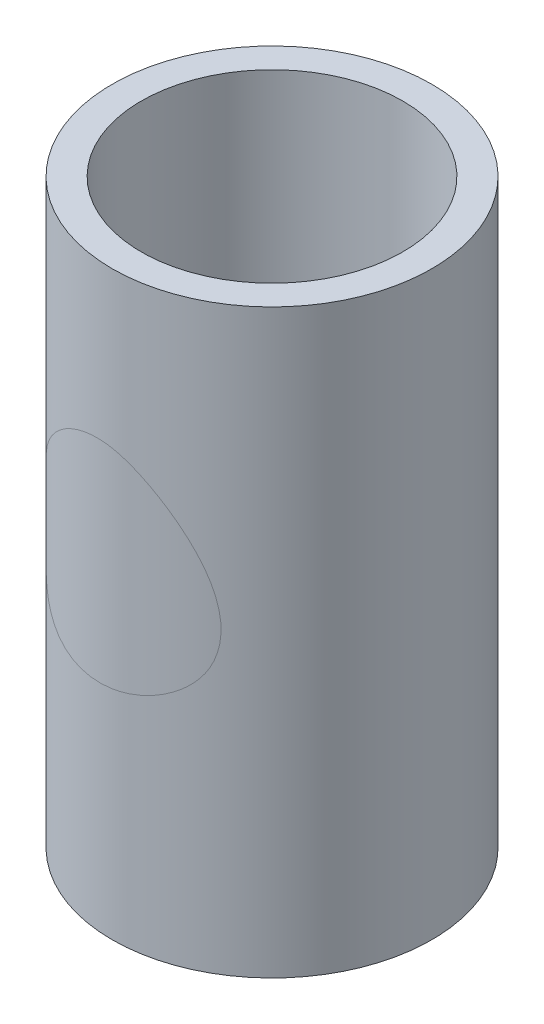
ISO-10303-21;
HEADER;
FILE_DESCRIPTION(('STEP AP214'),'2;1');
FILE_NAME('part.step','',(''),(''),'','','');
FILE_SCHEMA(('AUTOMOTIVE_DESIGN { 1 0 10303 214 1 1 1 1 }'));
ENDSEC;
DATA;
#1=APPLICATION_CONTEXT('core data for automotive mechanical design processes');
#2=APPLICATION_PROTOCOL_DEFINITION('international standard','automotive_design',2000,#1);
#3=PRODUCT_CONTEXT('',#1,'mechanical');
#4=PRODUCT('Part','Part','',(#3));
#5=PRODUCT_RELATED_PRODUCT_CATEGORY('part','',(#4));
#6=PRODUCT_DEFINITION_FORMATION('','',#4);
#7=PRODUCT_DEFINITION_CONTEXT('part definition',#1,'design');
#8=PRODUCT_DEFINITION('design','',#6,#7);
#9=PRODUCT_DEFINITION_SHAPE('','',#8);
#10=(LENGTH_UNIT() NAMED_UNIT(*) SI_UNIT(.MILLI.,.METRE.));
#11=(NAMED_UNIT(*) PLANE_ANGLE_UNIT() SI_UNIT($,.RADIAN.));
#12=(NAMED_UNIT(*) SI_UNIT($,.STERADIAN.) SOLID_ANGLE_UNIT());
#13=UNCERTAINTY_MEASURE_WITH_UNIT(LENGTH_MEASURE(1.E-05),#10,'distance_accuracy_value','');
#14=(GEOMETRIC_REPRESENTATION_CONTEXT(3) GLOBAL_UNCERTAINTY_ASSIGNED_CONTEXT((#13)) GLOBAL_UNIT_ASSIGNED_CONTEXT((#10,
#11,#12)) REPRESENTATION_CONTEXT('',''));
#15=CARTESIAN_POINT('',(0.,0.,0.));
#16=DIRECTION('',(0.,0.,1.));
#17=DIRECTION('',(1.,0.,0.));
#18=AXIS2_PLACEMENT_3D('',#15,#16,#17);
#19=CARTESIAN_POINT('',(0.,-110.603092707212,0.));
#20=DIRECTION('',(0.,-1.,0.));
#21=DIRECTION('',(0.,0.,-1.));
#22=AXIS2_PLACEMENT_3D('',#19,#20,#21);
#23=CYLINDRICAL_SURFACE('',#22,54.9999999999999);
#24=CARTESIAN_POINT('',(0.,-25.194290891013,54.9999999999999));
#25=CARTESIAN_POINT('',(-0.769635632629279,-25.3133468431184,54.9999985989301));
#26=CARTESIAN_POINT('',(-1.54168918856929,-25.4170021725145,54.9838323909333));
#27=CARTESIAN_POINT('',(-3.0881394742996,-25.5941521212312,54.9186911774526));
#28=CARTESIAN_POINT('',(-3.86253697855002,-25.6676353412383,54.8697037901726));
#29=CARTESIAN_POINT('',(-5.41086367903397,-25.7849432346175,54.7387084793448));
#30=CARTESIAN_POINT('',(-6.18479282171174,-25.8287649900198,54.6566973083218));
#31=CARTESIAN_POINT('',(-7.73044705579733,-25.8872555284095,54.4595989085027));
#32=CARTESIAN_POINT('',(-8.50216850853937,-25.9018901388309,54.3444730889367));
#33=CARTESIAN_POINT('',(-10.0399530573601,-25.9023261258038,54.0814911809593));
#34=CARTESIAN_POINT('',(-10.806016697777,-25.8881303133765,53.9336382847527));
#35=CARTESIAN_POINT('',(-12.3300781664512,-25.831276292568,53.6057550295856));
#36=CARTESIAN_POINT('',(-13.0880762826321,-25.7886191036896,53.4257258233684));
#37=CARTESIAN_POINT('',(-14.9674505826923,-25.6469616813471,52.9370293072579));
#38=CARTESIAN_POINT('',(-16.0825478212693,-25.5305083929235,52.6088520378179));
#39=CARTESIAN_POINT('',(-18.2821935004827,-25.2351696257859,51.8854758175703));
#40=CARTESIAN_POINT('',(-19.3667407008103,-25.0562816162055,51.4902741501819));
#41=CARTESIAN_POINT('',(-21.4999033570254,-24.6358503587398,50.6366929222699));
#42=CARTESIAN_POINT('',(-22.5484746693679,-24.3942330485546,50.1782389838428));
#43=CARTESIAN_POINT('',(-24.0880887387714,-23.9844422041611,49.4478236627187));
#44=CARTESIAN_POINT('',(-24.5957985639241,-23.8399354849473,49.1972042201271));
#45=CARTESIAN_POINT('',(-25.599439395016,-23.5349079956144,48.6825081122192));
#46=CARTESIAN_POINT('',(-26.0953710909357,-23.3743881664464,48.4184322380658));
#47=CARTESIAN_POINT('',(-27.2550417215235,-22.9749368012779,47.7781156032671));
#48=CARTESIAN_POINT('',(-27.913323136058,-22.7288979774651,47.3963810239539));
#49=CARTESIAN_POINT('',(-29.2044408088648,-22.2052864738067,46.6119220238927));
#50=CARTESIAN_POINT('',(-29.8372744627336,-21.9277105774227,46.2091954643957));
#51=CARTESIAN_POINT('',(-31.0756284644232,-21.3394137919747,45.3856638732849));
#52=CARTESIAN_POINT('',(-31.6811370708494,-21.028678844054,44.964851219006));
#53=CARTESIAN_POINT('',(-32.8609728761854,-20.372765564127,44.1099266252312));
#54=CARTESIAN_POINT('',(-33.4353699401493,-20.0276698047966,43.6758482266955));
#55=CARTESIAN_POINT('',(-34.2725665084919,-19.4816331316875,43.0176404443085));
#56=CARTESIAN_POINT('',(-34.5475399077,-19.2949083227681,42.7970780014399));
#57=CARTESIAN_POINT('',(-35.0890219562662,-18.911486057088,42.3542534724482));
#58=CARTESIAN_POINT('',(-35.3555311795514,-18.7147892788512,42.1319915028379));
#59=CARTESIAN_POINT('',(-35.8794718489683,-18.3110223212072,41.68670774502));
#60=CARTESIAN_POINT('',(-36.1369099138545,-18.1039599837386,41.4636866467071));
#61=CARTESIAN_POINT('',(-36.6423939119236,-17.6787119093581,41.0176623640266));
#62=CARTESIAN_POINT('',(-36.8904403993409,-17.4605268306319,40.7946591793793));
#63=CARTESIAN_POINT('',(-37.4756739546687,-16.9209293406651,40.2590198900827));
#64=CARTESIAN_POINT('',(-37.8080040951898,-16.5936775368405,39.9468829590219));
#65=CARTESIAN_POINT('',(-38.2901242636656,-16.0834563913702,39.4831133776639));
#66=CARTESIAN_POINT('',(-38.4480991044091,-15.9101620778471,39.3292655614228));
#67=CARTESIAN_POINT('',(-38.7583038022103,-15.5567487437245,39.0235987781884));
#68=CARTESIAN_POINT('',(-38.9105336269523,-15.3766296847474,38.8717798226105));
#69=CARTESIAN_POINT('',(-39.2086164614003,-15.009560677205,38.5710919578538));
#70=CARTESIAN_POINT('',(-39.3544804967693,-14.822623659968,38.4222182137393));
#71=CARTESIAN_POINT('',(-39.6396877758904,-14.4412119409531,38.1279050971707));
#72=CARTESIAN_POINT('',(-39.7790310507255,-14.2467372751135,37.9824657083474));
#73=CARTESIAN_POINT('',(-40.0508073531968,-13.8500442000312,37.6957801777937));
#74=CARTESIAN_POINT('',(-40.1832410169453,-13.6478265066091,37.5545336505783));
#75=CARTESIAN_POINT('',(-40.4409248106409,-13.2356475553262,37.2769028223812));
#76=CARTESIAN_POINT('',(-40.5661751063555,-13.0256864763402,37.1405184092261));
#77=CARTESIAN_POINT('',(-40.8939469172478,-12.4488403756668,36.7801438241746));
#78=CARTESIAN_POINT('',(-41.0894509764553,-12.0746190938184,36.5613784692761));
#79=CARTESIAN_POINT('',(-41.4573425621271,-11.3043684924336,36.1436892804378));
#80=CARTESIAN_POINT('',(-41.6297313052268,-10.9083403222145,35.9447644023696));
#81=CARTESIAN_POINT('',(-41.9498865643675,-10.0958376997679,35.570600916947));
#82=CARTESIAN_POINT('',(-42.0976633400668,-9.67937186131926,35.3953524457101));
#83=CARTESIAN_POINT('',(-42.3674350956991,-8.82787445058567,35.0719956399806));
#84=CARTESIAN_POINT('',(-42.4894308909443,-8.39284346593848,34.92388644724));
#85=CARTESIAN_POINT('',(-42.6708805438155,-7.65364481234964,34.7017167525567));
#86=CARTESIAN_POINT('',(-42.7376810396606,-7.35372665816883,34.6193583167352));
#87=CARTESIAN_POINT('',(-42.8592754080087,-6.74794089742885,34.4687090096695));
#88=CARTESIAN_POINT('',(-42.9140686185641,-6.4420729638768,34.4004189140087));
#89=CARTESIAN_POINT('',(-43.0116629190218,-5.8256071614727,34.2783162208957));
#90=CARTESIAN_POINT('',(-43.0544649991607,-5.51500968542458,34.2245024279941));
#91=CARTESIAN_POINT('',(-43.1282668344601,-4.8901733897323,34.1314536672551));
#92=CARTESIAN_POINT('',(-43.1592635795366,-4.57593366241732,34.0922224176857));
#93=CARTESIAN_POINT('',(-43.2097440388519,-3.94505668883369,34.0282188831055));
#94=CARTESIAN_POINT('',(-43.2292269843134,-3.62841928390126,34.0034475635865));
#95=CARTESIAN_POINT('',(-43.2570951274328,-2.99386511564483,33.9679882575203));
#96=CARTESIAN_POINT('',(-43.2654796999855,-2.67594828126966,33.9573010642482));
#97=CARTESIAN_POINT('',(-43.2714322096202,-2.06274814890926,33.9497153470685));
#98=CARTESIAN_POINT('',(-43.2697350281753,-1.76748223238851,33.951880015866));
#99=CARTESIAN_POINT('',(-43.2576676329082,-1.17740121349929,33.9672526988574));
#100=CARTESIAN_POINT('',(-43.2472962346749,-0.882586178203599,33.9804622211584));
#101=CARTESIAN_POINT('',(-43.2038704553997,0.000326940784108314,34.0356868490902));
#102=CARTESIAN_POINT('',(-43.1585046568898,0.586918547827248,34.0932978101956));
#103=CARTESIAN_POINT('',(-43.0386770819247,1.75334103508765,34.2444359798472));
#104=CARTESIAN_POINT('',(-42.9641593411883,2.33315668896356,34.338032265037));
#105=CARTESIAN_POINT('',(-42.7896021430997,3.48310140252437,34.5553084240023));
#106=CARTESIAN_POINT('',(-42.6895628090316,4.05323050898666,34.6789881524574));
#107=CARTESIAN_POINT('',(-42.4390698331557,5.32508555548958,34.9853341911194));
#108=CARTESIAN_POINT('',(-42.2822647103443,6.02385308481464,35.1750127493939));
#109=CARTESIAN_POINT('',(-41.9383230473946,7.40533194822248,35.5843866104059));
#110=CARTESIAN_POINT('',(-41.7511630916416,8.08803041737778,35.8041050651061));
#111=CARTESIAN_POINT('',(-41.3502642759264,9.43790194111241,36.2663657914871));
#112=CARTESIAN_POINT('',(-41.1365158268307,10.1050692908161,36.5089162898226));
#113=CARTESIAN_POINT('',(-40.6842273166771,11.4279464970682,37.0122778952439));
#114=CARTESIAN_POINT('',(-40.445571697369,12.0835848174212,37.273172103725));
#115=CARTESIAN_POINT('',(-39.9466009197799,13.3809205576133,37.8074417848611));
#116=CARTESIAN_POINT('',(-39.6862963104742,14.0226245772495,38.0808111497373));
#117=CARTESIAN_POINT('',(-39.1455286067727,15.2934865957804,38.6364840333939));
#118=CARTESIAN_POINT('',(-38.86506625121,15.9226450534235,38.9187872245146));
#119=CARTESIAN_POINT('',(-38.3496204909567,17.030755034864,39.425965544629));
#120=CARTESIAN_POINT('',(-38.1183883926008,17.512003658357,39.6496549086707));
#121=CARTESIAN_POINT('',(-37.6448442662995,18.4678545566681,40.0995305233786));
#122=CARTESIAN_POINT('',(-37.4025319431922,18.9424566539915,40.3257168404384));
#123=CARTESIAN_POINT('',(-36.9070504073754,19.8854964728257,40.779683540284));
#124=CARTESIAN_POINT('',(-36.6538764605303,20.3539313876446,41.0074645811952));
#125=CARTESIAN_POINT('',(-36.1370051861737,21.2846640873254,41.4636670291889));
#126=CARTESIAN_POINT('',(-35.8733075198563,21.7469616739596,41.6920884566677));
#127=CARTESIAN_POINT('',(-35.335395774469,22.665863149713,42.1489550435229));
#128=CARTESIAN_POINT('',(-35.0611749576457,23.1224631342559,42.377400121454));
#129=CARTESIAN_POINT('',(-34.5024927844746,24.0297586397919,42.8334919655609));
#130=CARTESIAN_POINT('',(-34.2180314058509,24.4804541479384,43.061138729999));
#131=CARTESIAN_POINT('',(-33.6387247673434,25.376293168214,43.5151896844233));
#132=CARTESIAN_POINT('',(-33.3438723279378,25.8214325420117,43.7415928852061));
#133=CARTESIAN_POINT('',(-32.7439896633503,26.7057906956176,44.1924420354581));
#134=CARTESIAN_POINT('',(-32.4389594489086,27.1450094816729,44.4168879869924));
#135=CARTESIAN_POINT('',(-31.5114501684446,28.44917960554,45.0844436389375));
#136=CARTESIAN_POINT('',(-30.8736582615573,29.3051256542327,45.5240498634805));
#137=CARTESIAN_POINT('',(-29.5558824433042,30.989933758079,46.3904245688644));
#138=CARTESIAN_POINT('',(-28.8759169606291,31.8188074047556,46.8171985376761));
#139=CARTESIAN_POINT('',(-27.4718899595584,33.4454290725943,47.6546208353841));
#140=CARTESIAN_POINT('',(-26.7478724548424,34.2432068959585,48.0652846068406));
#141=CARTESIAN_POINT('',(-25.6265723554847,35.4127111401458,48.6668097614373));
#142=CARTESIAN_POINT('',(-25.2470707714862,35.7978839699981,48.8648371645455));
#143=CARTESIAN_POINT('',(-24.4757857695502,36.5584352039616,49.2556884017118));
#144=CARTESIAN_POINT('',(-24.0840028232211,36.9338139831557,49.4485124350532));
#145=CARTESIAN_POINT('',(-23.1420147353813,37.8091772299366,49.8979991046556));
#146=CARTESIAN_POINT('',(-22.5862875068839,38.3045079905392,50.1522095266265));
#147=CARTESIAN_POINT('',(-21.4498420122877,39.2719696988885,50.6486798393438));
#148=CARTESIAN_POINT('',(-20.8691246715872,39.7441015043216,50.8909401718971));
#149=CARTESIAN_POINT('',(-19.6808501243504,40.6617226678641,51.362174912013));
#150=CARTESIAN_POINT('',(-19.0732702814085,41.107188781683,51.5911377231902));
#151=CARTESIAN_POINT('',(-17.8304580787995,41.9661942822453,52.0337378285605));
#152=CARTESIAN_POINT('',(-17.1952256134839,42.3797335469934,52.2473750641932));
#153=CARTESIAN_POINT('',(-15.8887703000662,43.1732606252921,52.6594849207539));
#154=CARTESIAN_POINT('',(-15.2172246160249,43.5528219140228,52.8577614239088));
#155=CARTESIAN_POINT('',(-13.8440348809459,44.2654596954617,53.2339121250028));
#156=CARTESIAN_POINT('',(-13.1423859101492,44.5985285518207,53.4117829704743));
#157=CARTESIAN_POINT('',(-11.7109207972726,45.2081097315352,53.7437728710584));
#158=CARTESIAN_POINT('',(-10.9811601891806,45.4847273831224,53.897936025643));
#159=CARTESIAN_POINT('',(-9.49472397822451,45.9710620967721,54.1795277161191));
#160=CARTESIAN_POINT('',(-8.7380658969735,46.1808218549953,54.3069732962642));
#161=CARTESIAN_POINT('',(-7.46387794637227,46.4636578817643,54.4936063178729));
#162=CARTESIAN_POINT('',(-6.95247130555767,46.5589592304044,54.561271679455));
#163=CARTESIAN_POINT('',(-5.92236853464055,46.7118769274929,54.6826686520292));
#164=CARTESIAN_POINT('',(-5.40367329673325,46.7694978480434,54.7364019530448));
#165=CARTESIAN_POINT('',(-4.36306789148308,46.843936941327,54.8291527050792));
#166=CARTESIAN_POINT('',(-3.84116627898419,46.8608368737767,54.8681995103591));
#167=CARTESIAN_POINT('',(-2.79676465940698,46.8517224163309,54.9313354288999));
#168=CARTESIAN_POINT('',(-2.27426468853063,46.8257104984335,54.9554254036604));
#169=CARTESIAN_POINT('',(-1.4054486416883,46.7454315356884,54.9831451614988));
#170=CARTESIAN_POINT('',(-1.0580976962638,46.703376572707,54.9909089119142));
#171=CARTESIAN_POINT('',(-0.539252139542642,46.6254381248459,54.9976284843881));
#172=CARTESIAN_POINT('',(-0.366653373741229,46.5969797699011,54.9990472493979));
#173=CARTESIAN_POINT('',(-0.0223394076427391,46.5351129507948,55.0002649512526));
#174=CARTESIAN_POINT('',(0.149375784122106,46.5017044389246,55.0000638724847));
#175=CARTESIAN_POINT('',(0.662946786684946,46.3942189704753,54.9970696139749));
#176=CARTESIAN_POINT('',(1.00329440314275,46.3128720659831,54.9918862512293));
#177=CARTESIAN_POINT('',(1.67954133120593,46.1319277308365,54.9753924862206));
#178=CARTESIAN_POINT('',(2.01543186039246,46.0322987524968,54.9640714256627));
#179=CARTESIAN_POINT('',(2.6815131577887,45.8161605951438,54.9356042221575));
#180=CARTESIAN_POINT('',(3.01170334646845,45.6996497109964,54.9184574905607));
#181=CARTESIAN_POINT('',(3.66584643000666,45.4510378449892,54.878675117683));
#182=CARTESIAN_POINT('',(3.98979842513981,45.3189346335721,54.8560386909378));
#183=CARTESIAN_POINT('',(4.76528656234023,44.9820879171666,54.7950743332915));
#184=CARTESIAN_POINT('',(5.21347592024361,44.7700821136861,54.7541441721922));
#185=CARTESIAN_POINT('',(6.09594255446588,44.3204981372511,54.6629342654439));
#186=CARTESIAN_POINT('',(6.53021533264166,44.0829118021627,54.6126515318679));
#187=CARTESIAN_POINT('',(7.38454745900423,43.5851561703819,54.5037055208399));
#188=CARTESIAN_POINT('',(7.80460539128554,43.324984633182,54.4450414115611));
#189=CARTESIAN_POINT('',(8.63136109349406,42.78411885077,54.3201138843861));
#190=CARTESIAN_POINT('',(9.03802881788932,42.5033824796317,54.2538347001963));
#191=CARTESIAN_POINT('',(9.83722584766964,41.9241841111286,54.1146328598499));
#192=CARTESIAN_POINT('',(10.2297574665812,41.6257250356499,54.0417112977484));
#193=CARTESIAN_POINT('',(11.0010822522829,41.0129660487566,53.889986756296));
#194=CARTESIAN_POINT('',(11.3798742190562,40.6986647593895,53.8111832650485));
#195=CARTESIAN_POINT('',(12.3788688652572,39.8358441476654,53.5926820781402));
#196=CARTESIAN_POINT('',(12.986814635363,39.2742818404481,53.4482288504389));
#197=CARTESIAN_POINT('',(14.1668191941351,38.1171775737913,53.1476442869675));
#198=CARTESIAN_POINT('',(14.7388575493716,37.5216166286528,52.9915064107613));
#199=CARTESIAN_POINT('',(15.8486239690971,36.3014521908356,52.6702462452911));
#200=CARTESIAN_POINT('',(16.3863435569174,35.6768415883018,52.5051217548674));
#201=CARTESIAN_POINT('',(17.4296957926028,34.4013447976111,52.1680624112938));
#202=CARTESIAN_POINT('',(17.9352715759002,33.7504152034106,51.9961163173305));
#203=CARTESIAN_POINT('',(18.914361595887,32.4263435063975,51.6480081430544));
#204=CARTESIAN_POINT('',(19.3878860009683,31.7532085500583,51.4718474240765));
#205=CARTESIAN_POINT('',(20.3038746256791,30.3867285029559,51.1174509376898));
#206=CARTESIAN_POINT('',(20.7463399088256,29.6933841053498,50.9392152415755));
#207=CARTESIAN_POINT('',(21.6336653090849,28.2339374881073,50.5690919455115));
#208=CARTESIAN_POINT('',(22.0760804685246,27.4663468547471,50.3772111646804));
#209=CARTESIAN_POINT('',(22.9256454965967,25.9111200140025,49.9963145288728));
#210=CARTESIAN_POINT('',(23.3327922648911,25.1234820521763,49.807298926968));
#211=CARTESIAN_POINT('',(24.1114690448692,23.5292466091889,49.435041174254));
#212=CARTESIAN_POINT('',(24.4829919919822,22.7226454067505,49.2518001734247));
#213=CARTESIAN_POINT('',(25.188790829937,21.0929182551225,48.8945904468529));
#214=CARTESIAN_POINT('',(25.5231271449187,20.2698217560021,48.7206069260317));
#215=CARTESIAN_POINT('',(26.1536243381807,18.6067757766362,48.3850744533859));
#216=CARTESIAN_POINT('',(26.4497918430306,17.7668292511021,48.2235233451107));
#217=CARTESIAN_POINT('',(27.0016529270463,16.071041402196,47.9167026375366));
#218=CARTESIAN_POINT('',(27.2573583655407,15.2152048186378,47.771428271224));
#219=CARTESIAN_POINT('',(27.7275170110281,13.4803241218874,47.5000967871307));
#220=CARTESIAN_POINT('',(27.9415588176917,12.6011373201116,47.3742336412475));
#221=CARTESIAN_POINT('',(28.3212354204254,10.8290031103219,47.1482397950509));
#222=CARTESIAN_POINT('',(28.4868712105377,9.93605598527992,47.0481085663245));
#223=CARTESIAN_POINT('',(28.7644877794294,8.13937064023945,46.8788944397331));
#224=CARTESIAN_POINT('',(28.8765013686601,7.23563936675941,46.8097925571834));
#225=CARTESIAN_POINT('',(29.0407711838624,5.42063665910498,46.708064240028));
#226=CARTESIAN_POINT('',(29.0930396840441,4.5093668124397,46.675430313367));
#227=CARTESIAN_POINT('',(29.1267876621617,2.87240456911359,46.6543711011255));
#228=CARTESIAN_POINT('',(29.1206090917261,2.1470672839492,46.6582377549517));
#229=CARTESIAN_POINT('',(29.0621169421589,0.698917113209374,46.694696806459));
#230=CARTESIAN_POINT('',(29.0098088364805,-0.0238960616467437,46.7272857961202));
#231=CARTESIAN_POINT('',(28.8552480747175,-1.46125120434941,46.8228889157461));
#232=CARTESIAN_POINT('',(28.7530620720109,-2.17580291137324,46.885862440628));
#233=CARTESIAN_POINT('',(28.495082272075,-3.59194185867211,47.0430999148776));
#234=CARTESIAN_POINT('',(28.3392841019793,-4.29352803649609,47.1373664166289));
#235=CARTESIAN_POINT('',(28.0312165979056,-5.4511282774721,47.3209408783482));
#236=CARTESIAN_POINT('',(27.8943565661119,-5.91263254739829,47.4018458481041));
#237=CARTESIAN_POINT('',(27.5943214920716,-6.82442840573641,47.5771339703477));
#238=CARTESIAN_POINT('',(27.431146706705,-7.27472010355399,47.6715169912639));
#239=CARTESIAN_POINT('',(27.0781166723877,-8.16174691189086,47.8729240081288));
#240=CARTESIAN_POINT('',(26.888267626078,-8.59848514529267,47.9799450643993));
#241=CARTESIAN_POINT('',(26.5834686070219,-9.24173293230334,48.1490671377243));
#242=CARTESIAN_POINT('',(26.4785281522301,-9.45417802852776,48.2068746427919));
#243=CARTESIAN_POINT('',(26.2619802451615,-9.8748890786998,48.325186217763));
#244=CARTESIAN_POINT('',(26.1503728280338,-10.0831550546726,48.3856902734495));
#245=CARTESIAN_POINT('',(25.9205171668667,-10.4952634892544,48.5092136954321));
#246=CARTESIAN_POINT('',(25.8022680846894,-10.6991053850511,48.5722333788936));
#247=CARTESIAN_POINT('',(25.5592178790917,-11.1021053641018,48.7005673395371));
#248=CARTESIAN_POINT('',(25.4344167504627,-11.3012634436324,48.7658816185431));
#249=CARTESIAN_POINT('',(25.1785442488099,-11.6948396914445,48.8984833201898));
#250=CARTESIAN_POINT('',(25.0474728174892,-11.889257815632,48.9657707611732));
#251=CARTESIAN_POINT('',(24.779333874754,-12.2733065195397,49.1020085287406));
#252=CARTESIAN_POINT('',(24.642266309833,-12.462937056514,49.170958870161));
#253=CARTESIAN_POINT('',(24.2084137434843,-13.0434235599045,49.3868440652752));
#254=CARTESIAN_POINT('',(23.9018147501748,-13.4261388662032,49.5361197909573));
#255=CARTESIAN_POINT('',(23.265656969773,-14.1705310674886,49.8380700752228));
#256=CARTESIAN_POINT('',(22.9360953651872,-14.5322053707359,49.9907450493218));
#257=CARTESIAN_POINT('',(22.2561429392372,-15.2349353233023,50.2971485223119));
#258=CARTESIAN_POINT('',(21.9057513202993,-15.5759901821006,50.450877061344));
#259=CARTESIAN_POINT('',(21.1850503943711,-16.2389742287854,50.7577332884697));
#260=CARTESIAN_POINT('',(20.8146863330798,-16.5608451549797,50.91085794626));
#261=CARTESIAN_POINT('',(20.056765343306,-17.1849953388242,51.2141852011735));
#262=CARTESIAN_POINT('',(19.6692103753942,-17.4872768209634,51.3643881287147));
#263=CARTESIAN_POINT('',(18.8784021517568,-18.0729789257967,51.6602767261643));
#264=CARTESIAN_POINT('',(18.4751474077695,-18.3563977534701,51.8059619654548));
#265=CARTESIAN_POINT('',(17.6573757323872,-18.9030002629081,52.0903362428539));
#266=CARTESIAN_POINT('',(17.2429619814029,-19.166316066326,52.2290684409297));
#267=CARTESIAN_POINT('',(16.4013073030036,-19.6756067263758,52.4994527189071));
#268=CARTESIAN_POINT('',(15.974064817393,-19.9215794642477,52.6311039332778));
#269=CARTESIAN_POINT('',(15.1078610268787,-20.396766619091,52.886259025641));
#270=CARTESIAN_POINT('',(14.6688972602169,-20.6259774772556,53.0097611729196));
#271=CARTESIAN_POINT('',(13.7804030266315,-21.0681062164449,53.2476494543975));
#272=CARTESIAN_POINT('',(13.330871496773,-21.2810224492665,53.3620346664662));
#273=CARTESIAN_POINT('',(11.969362822324,-21.8953990961488,53.689887886416));
#274=CARTESIAN_POINT('',(11.0430001282284,-22.2732875138669,53.888490763203));
#275=CARTESIAN_POINT('',(9.16007218817373,-22.9690319229291,54.240302205563));
#276=CARTESIAN_POINT('',(8.20351651810221,-23.2869067290433,54.3935250067662));
#277=CARTESIAN_POINT('',(6.64590190327571,-23.7521616456699,54.6002374272896));
#278=CARTESIAN_POINT('',(6.05218887395702,-23.9175870791709,54.6692924363778));
#279=CARTESIAN_POINT('',(4.85750188251285,-24.2277152355963,54.7883644342971));
#280=CARTESIAN_POINT('',(4.25652841454786,-24.3724193603352,54.8383827113596));
#281=CARTESIAN_POINT('',(3.04881808660646,-24.6415386703481,54.9187669987816));
#282=CARTESIAN_POINT('',(2.44208174901025,-24.7659556763374,54.9491347734488));
#283=CARTESIAN_POINT('',(1.22407524499583,-24.994936319762,54.989754128211));
#284=CARTESIAN_POINT('',(0.612804075418359,-25.0994954195459,55.0000011155684));
#285=CARTESIAN_POINT('',(0.,-25.194290891013,54.9999999999999));
#286=B_SPLINE_CURVE_WITH_KNOTS('',3,(#24,#25,#26,#27,#28,#29,#30,#31,#32,#33,#34,#35,#36,#37,
#38,#39,#40,#41,#42,#43,#44,#45,#46,#47,#48,#49,#50,#51,#52,#53,#54,#55,#56,#57,#58,#59,#60,#61,
#62,#63,#64,#65,#66,#67,#68,#69,#70,#71,#72,#73,#74,#75,#76,#77,#78,#79,#80,#81,#82,#83,#84,#85,
#86,#87,#88,#89,#90,#91,#92,#93,#94,#95,#96,#97,#98,#99,#100,#101,#102,#103,#104,#105,#106,#107,
#108,#109,#110,#111,#112,#113,#114,#115,#116,#117,#118,#119,#120,#121,#122,#123,#124,#125,#126,
#127,#128,#129,#130,#131,#132,#133,#134,#135,#136,#137,#138,#139,#140,#141,#142,#143,#144,#145,
#146,#147,#148,#149,#150,#151,#152,#153,#154,#155,#156,#157,#158,#159,#160,#161,#162,#163,#164,
#165,#166,#167,#168,#169,#170,#171,#172,#173,#174,#175,#176,#177,#178,#179,#180,#181,#182,#183,
#184,#185,#186,#187,#188,#189,#190,#191,#192,#193,#194,#195,#196,#197,#198,#199,#200,#201,#202,
#203,#204,#205,#206,#207,#208,#209,#210,#211,#212,#213,#214,#215,#216,#217,#218,#219,#220,#221,
#222,#223,#224,#225,#226,#227,#228,#229,#230,#231,#232,#233,#234,#235,#236,#237,#238,#239,#240,
#241,#242,#243,#244,#245,#246,#247,#248,#249,#250,#251,#252,#253,#254,#255,#256,#257,#258,#259,
#260,#261,#262,#263,#264,#265,#266,#267,#268,#269,#270,#271,#272,#273,#274,#275,#276,#277,#278,
#279,#280,#281,#282,#283,#284,#285),.UNSPECIFIED.,.T.,.F.,(4,2,2,2,2,2,2,2,2,2,2,2,2,2,2,2,2,2,
2,2,2,2,2,2,2,2,2,2,2,2,2,2,2,2,2,2,2,2,2,2,2,2,2,2,2,2,2,2,2,2,2,2,2,2,2,2,2,2,2,2,2,2,2,2,2,2,
2,2,2,2,2,2,2,2,2,2,2,2,2,2,2,2,2,2,2,2,2,2,2,2,2,2,2,2,2,2,2,2,2,2,2,2,2,2,2,2,2,2,2,2,2,2,2,2,
2,2,2,2,2,2,2,2,2,2,2,2,2,2,2,2,4),(0.,2.33611138726129,4.67310456958641,7.01032762203285,
9.35028551311002,11.6900152647806,14.0296612104727,17.5299810668807,21.0304428294468,
24.5350564102534,26.2876888486155,28.0402183606163,30.4381186351565,32.8362636969612,
35.2354296007103,37.6289631653045,38.8254966640189,40.0219488558615,41.217509176721,
42.4129988324761,44.0955663562827,44.936819696784,45.7780777686255,46.617815712184,
47.4575496524992,48.2972061483778,49.1368432600586,50.5619469632506,51.9869756290667,
53.4114087675106,54.8357968521385,55.7895947446119,56.7434452056326,57.6972168737317,
58.6512315687145,59.6053099561299,60.5594420788154,61.4449214339093,62.3305217155311,
64.1016460376845,65.8761872841445,67.6507199587166,69.8714682897255,72.0939379182299,
74.317211416475,76.5513017378431,78.784309754045,81.017235966487,82.7537379345908,
84.4902861876701,86.2275991771864,87.964968143812,89.7034687053072,91.4419730487139,
93.1817030846956,94.9214312848813,98.3834989589722,101.844064320145,105.301227166109,
107.028555546408,108.755817677798,111.11497179881,113.474038634039,115.835132771366,
118.196235930188,120.583721344205,122.971598440758,125.354978593112,127.736833629798,
129.309228742063,130.881433026195,132.450477993973,134.019432577843,135.068727084126,
135.593458320312,136.118194614091,137.167466125827,138.218565592412,139.269771297985,
140.321127498677,141.812498738542,143.304347257371,144.796343940727,146.291487302457,
147.78638484537,149.281412639308,151.79991240889,154.319832597683,156.840372812124,
159.365254612251,161.889331595065,164.413322107002,167.131889448105,169.850695528266,
172.57003966538,175.284898547901,177.999285461141,180.712875314934,183.452033895656,
186.191136222398,188.928560393086,191.665422078017,193.839741040681,196.01380204643,
198.184965708338,200.35630650279,201.819743774548,203.283166761351,204.746250015756,
205.477832461514,206.20941105061,206.941082168811,207.672753868654,208.404432372393,
209.136117406607,210.67277685522,212.209625183854,213.7465323958,215.287891465907,
216.829075198413,218.370405385002,219.900530899855,221.430843023677,222.961479118793,
224.492269833852,227.548674249317,230.60411885942,232.464060474279,234.323876202967,
236.183524926117,238.043598080285),.UNSPECIFIED.);
#287=CARTESIAN_POINT('',(0.,46.5300158639171,54.9999999999998));
#288=VERTEX_POINT('',#287);
#289=CARTESIAN_POINT('',(0.,-25.194290891013,54.9999999999999));
#290=VERTEX_POINT('',#289);
#291=EDGE_CURVE('E59',#288,#290,#286,.T.);
#292=ORIENTED_EDGE('',*,*,#291,.T.);
#293=EDGE_CURVE('E50',#290,#288,#286,.T.);
#294=ORIENTED_EDGE('',*,*,#293,.T.);
#295=EDGE_LOOP('',(#292,#294));
#296=FACE_BOUND('',#295,.T.);
#297=CARTESIAN_POINT('',(0.,-100.,0.));
#298=DIRECTION('',(0.,-1.,0.));
#299=DIRECTION('',(0.,0.,-1.));
#300=AXIS2_PLACEMENT_3D('',#297,#298,#299);
#301=CIRCLE('',#300,54.9999999999999);
#302=CARTESIAN_POINT('',(0.,-100.,-54.9999999999999));
#303=VERTEX_POINT('',#302);
#304=EDGE_CURVE('E68',#303,#303,#301,.T.);
#305=ORIENTED_EDGE('',*,*,#304,.F.);
#306=EDGE_LOOP('',(#305));
#307=FACE_BOUND('',#306,.T.);
#308=CARTESIAN_POINT('',(0.,100.,0.));
#309=DIRECTION('',(0.,-1.,0.));
#310=DIRECTION('',(0.,0.,-1.));
#311=AXIS2_PLACEMENT_3D('',#308,#309,#310);
#312=CIRCLE('',#311,54.9999999999999);
#313=CARTESIAN_POINT('',(0.,100.,-54.9999999999999));
#314=VERTEX_POINT('',#313);
#315=EDGE_CURVE('E127',#314,#314,#312,.T.);
#316=ORIENTED_EDGE('',*,*,#315,.T.);
#317=EDGE_LOOP('',(#316));
#318=FACE_BOUND('',#317,.T.);
#319=CARTESIAN_POINT('',(0.,46.5300158639171,-54.9999999999999));
#320=CARTESIAN_POINT('',(-0.347274072463136,46.5962932898601,-55.0000006306337));
#321=CARTESIAN_POINT('',(-0.696452490277688,46.652485207559,-54.9967075388781));
#322=CARTESIAN_POINT('',(-1.39742711491896,46.7446241824047,-54.9833618745976));
#323=CARTESIAN_POINT('',(-1.74922387435664,46.7805668356074,-54.9733078326986));
#324=CARTESIAN_POINT('',(-2.45401522433965,46.8323599662562,-54.9463572917859));
#325=CARTESIAN_POINT('',(-2.80700978975613,46.8482108626274,-54.9294609354482));
#326=CARTESIAN_POINT('',(-3.51341146161386,46.8602597888682,-54.8888083801226));
#327=CARTESIAN_POINT('',(-3.86681847388324,46.8564309779848,-54.8650428541009));
#328=CARTESIAN_POINT('',(-4.57238767304861,46.8297050169295,-54.8107511918466));
#329=CARTESIAN_POINT('',(-4.92454984590823,46.806807652432,-54.7802249796285));
#330=CARTESIAN_POINT('',(-5.62655921534098,46.7427766141604,-54.7125788825054));
#331=CARTESIAN_POINT('',(-5.97640625270553,46.7016416991747,-54.6754585489206));
#332=CARTESIAN_POINT('',(-6.97168358471207,46.5593377791068,-54.5602358305966));
#333=CARTESIAN_POINT('',(-7.61327312306928,46.436938329598,-54.4742905230481));
#334=CARTESIAN_POINT('',(-8.88077941073056,46.1390977390454,-54.2820712739468));
#335=CARTESIAN_POINT('',(-9.50669189099897,45.9636423167187,-54.1757918618163));
#336=CARTESIAN_POINT('',(-10.7409378247489,45.5662403119146,-53.9446663861476));
#337=CARTESIAN_POINT('',(-11.3492449379324,45.3442277902361,-53.8197940628436));
#338=CARTESIAN_POINT('',(-12.5459009463471,44.8602201808444,-53.5534894073903));
#339=CARTESIAN_POINT('',(-13.1342490169691,44.5982234436333,-53.4120563921069));
#340=CARTESIAN_POINT('',(-14.1747625081278,44.0957546778066,-53.1441828725921));
#341=CARTESIAN_POINT('',(-14.6306288415494,43.8614589998109,-53.0204018972281));
#342=CARTESIAN_POINT('',(-15.5293559213616,43.3733547659801,-52.7641684289965));
#343=CARTESIAN_POINT('',(-15.9722148830231,43.1195435495621,-52.6317147541333));
#344=CARTESIAN_POINT('',(-16.845255713581,42.5945133071712,-52.3588258850593));
#345=CARTESIAN_POINT('',(-17.2754309863727,42.3232854488566,-52.2183866454023));
#346=CARTESIAN_POINT('',(-18.1231513202447,41.7654596719832,-51.9302589083571));
#347=CARTESIAN_POINT('',(-18.5406968678468,41.4788623466687,-51.78257069079));
#348=CARTESIAN_POINT('',(-19.3644928768522,40.8912546153079,-51.4801844122918));
#349=CARTESIAN_POINT('',(-19.7707146180704,40.590212048619,-51.3254707554013));
#350=CARTESIAN_POINT('',(-20.5712658186651,39.9757441395017,-51.0098829325783));
#351=CARTESIAN_POINT('',(-20.9655942197109,39.6623177007915,-50.8490082212777));
#352=CARTESIAN_POINT('',(-21.7426185763399,39.0244252101276,-50.521641178724));
#353=CARTESIAN_POINT('',(-22.1253175695613,38.6999620887444,-50.3551503388177));
#354=CARTESIAN_POINT('',(-22.8795920119946,38.0409670855096,-50.0169479432952));
#355=CARTESIAN_POINT('',(-23.2511668084688,37.7064346151164,-49.8452360825104));
#356=CARTESIAN_POINT('',(-24.2900029601366,36.7444738151203,-49.3512985285587));
#357=CARTESIAN_POINT('',(-24.9445328085849,36.1061789136673,-49.0233498980799));
#358=CARTESIAN_POINT('',(-26.2196743823656,34.8031596408384,-48.3533613965816));
#359=CARTESIAN_POINT('',(-26.8402703707657,34.1384232498911,-48.0113151145443));
#360=CARTESIAN_POINT('',(-28.0494266730073,32.7858395564022,-47.3150776553744));
#361=CARTESIAN_POINT('',(-28.6379690651547,32.0979796657434,-46.9608798608967));
#362=CARTESIAN_POINT('',(-29.7842479363028,30.701995603904,-46.2423634337243));
#363=CARTESIAN_POINT('',(-30.3419788978686,29.9938678375777,-45.8780430058012));
#364=CARTESIAN_POINT('',(-31.4279184199939,28.5590983983881,-45.1410746857431));
#365=CARTESIAN_POINT('',(-31.956116801237,27.8324504660913,-44.7684239835218));
#366=CARTESIAN_POINT('',(-32.7266403302311,26.729950135188,-44.2048435771946));
#367=CARTESIAN_POINT('',(-32.979807397409,26.3604319039547,-44.0162515842726));
#368=CARTESIAN_POINT('',(-33.4789951149794,25.6172555103921,-43.6377703920275));
#369=CARTESIAN_POINT('',(-33.7250157722482,25.2435973520467,-43.4478811939529));
#370=CARTESIAN_POINT('',(-34.4521893716706,24.1166681260441,-42.8768748376983));
#371=CARTESIAN_POINT('',(-34.9226286650816,23.3571922425801,-42.4942906887966));
#372=CARTESIAN_POINT('',(-35.834422335712,21.8216752419221,-41.7282700282815));
#373=CARTESIAN_POINT('',(-36.2757833586788,21.0456379638364,-41.3448337322773));
#374=CARTESIAN_POINT('',(-37.0103728551023,19.6937748101394,-40.6866509237274));
#375=CARTESIAN_POINT('',(-37.3107297756717,19.1221280355195,-40.4112600700455));
#376=CARTESIAN_POINT('',(-37.8953522155323,17.9692447902882,-39.8635506213406));
#377=CARTESIAN_POINT('',(-38.1796186394029,17.3880088611394,-39.5912318543009));
#378=CARTESIAN_POINT('',(-38.7314165478026,16.2152445020429,-39.051585150378));
#379=CARTESIAN_POINT('',(-38.9989459065664,15.6237147768315,-38.7842578504709));
#380=CARTESIAN_POINT('',(-39.5161123039019,14.4300971039593,-38.2571961487548));
#381=CARTESIAN_POINT('',(-39.7657616892657,13.828016806527,-37.99745658217));
#382=CARTESIAN_POINT('',(-40.24610261298,12.612073529168,-37.4883140695335));
#383=CARTESIAN_POINT('',(-40.4767957071305,11.9982115213132,-37.2389102760282));
#384=CARTESIAN_POINT('',(-40.9175635978863,10.7577822722589,-36.7540506956494));
#385=CARTESIAN_POINT('',(-41.1276424395297,10.1312175528858,-36.5185921759696));
#386=CARTESIAN_POINT('',(-41.4656945027227,9.05349449222822,-36.1336528378827));
#387=CARTESIAN_POINT('',(-41.599454382391,8.60582113741409,-35.9794918095364));
#388=CARTESIAN_POINT('',(-41.8548188557922,7.70340372018669,-35.6821037510361));
#389=CARTESIAN_POINT('',(-41.97642357426,7.24865973038682,-35.5388766086833));
#390=CARTESIAN_POINT('',(-42.2063677979483,6.33178286002721,-35.2654850987007));
#391=CARTESIAN_POINT('',(-42.314703934256,5.86964813648381,-35.1353240500787));
#392=CARTESIAN_POINT('',(-42.5165299121752,4.93889246804725,-34.8908265234293));
#393=CARTESIAN_POINT('',(-42.6100461091928,4.47028468613357,-34.7764620008647));
#394=CARTESIAN_POINT('',(-42.7808523056016,3.52606914533392,-34.5661256917526));
#395=CARTESIAN_POINT('',(-42.8581451197062,3.05046261605999,-34.4701507149205));
#396=CARTESIAN_POINT('',(-42.9946487155086,2.09298618411332,-34.299739430871));
#397=CARTESIAN_POINT('',(-43.0538673168446,1.61111908436036,-34.2252938099138));
#398=CARTESIAN_POINT('',(-43.1519379926661,0.644709823770726,-34.1015613109392));
#399=CARTESIAN_POINT('',(-43.1908985430514,0.160196248830134,-34.0521404706514));
#400=CARTESIAN_POINT('',(-43.2467673349454,-0.812173378119785,-33.9811595930138));
#401=CARTESIAN_POINT('',(-43.2636778970749,-1.30002907295887,-33.9595966238029));
#402=CARTESIAN_POINT('',(-43.2733017858542,-2.27581863346004,-33.9473334148354));
#403=CARTESIAN_POINT('',(-43.2660460125222,-2.76375160221699,-33.9565937631742));
#404=CARTESIAN_POINT('',(-43.2254815525308,-3.73689793996881,-34.0082181578522));
#405=CARTESIAN_POINT('',(-43.1921733723061,-4.2221113616445,-34.0505815606985));
#406=CARTESIAN_POINT('',(-43.1135334226331,-5.02757992192039,-34.1500468869678));
#407=CARTESIAN_POINT('',(-43.0757225107611,-5.34976871569021,-34.1977648697441));
#408=CARTESIAN_POINT('',(-42.9874381482939,-5.98976773776589,-34.3086755382786));
#409=CARTESIAN_POINT('',(-42.9369638364738,-6.30757766671823,-34.3718692765202));
#410=CARTESIAN_POINT('',(-42.8232462296748,-6.9374557583276,-34.5134438853714));
#411=CARTESIAN_POINT('',(-42.7600036363766,-7.24952423547825,-34.5918239214084));
#412=CARTESIAN_POINT('',(-42.6207615604788,-7.86687564439582,-34.763240308945));
#413=CARTESIAN_POINT('',(-42.544756049976,-8.17215529229521,-34.8562835845838));
#414=CARTESIAN_POINT('',(-42.3801928825884,-8.77471567416222,-35.056183463862));
#415=CARTESIAN_POINT('',(-42.2916346195716,-9.07199602104421,-35.1630407345127));
#416=CARTESIAN_POINT('',(-42.1022932489306,-9.65760931880886,-35.3895278858198));
#417=CARTESIAN_POINT('',(-42.0015110444269,-9.94594292871369,-35.5091568228111));
#418=CARTESIAN_POINT('',(-41.7497424812792,-10.6149289768283,-35.8051546466884));
#419=CARTESIAN_POINT('',(-41.5937297398411,-10.9915217806241,-35.9864647578922));
#420=CARTESIAN_POINT('',(-41.261026099039,-11.7256561967765,-36.367453138005));
#421=CARTESIAN_POINT('',(-41.0843371654795,-12.0831996155713,-36.567129660328));
#422=CARTESIAN_POINT('',(-40.7115099474379,-12.7787386828195,-36.9817615283185));
#423=CARTESIAN_POINT('',(-40.5153701121574,-13.11673276922,-37.1967180918586));
#424=CARTESIAN_POINT('',(-40.1048584179564,-13.773037624113,-37.6389602423837));
#425=CARTESIAN_POINT('',(-39.8904848536946,-14.0913465466973,-37.8662469818482));
#426=CARTESIAN_POINT('',(-39.5390899329043,-14.5778532834093,-38.2321178819554));
#427=CARTESIAN_POINT('',(-39.4077212923297,-14.7525761498282,-38.3675400534269));
#428=CARTESIAN_POINT('',(-39.1396810410447,-15.0958546462117,-38.6409373155027));
#429=CARTESIAN_POINT('',(-39.0030092635255,-15.2644100818569,-38.7789124863393));
#430=CARTESIAN_POINT('',(-38.5853273525261,-15.7614376919907,-39.1960103635585));
#431=CARTESIAN_POINT('',(-38.2967868803672,-16.0810840598944,-39.478163077537));
#432=CARTESIAN_POINT('',(-37.7016336336154,-16.6989232958155,-40.0469278024045));
#433=CARTESIAN_POINT('',(-37.3950161076337,-16.9971104773347,-40.3335409709818));
#434=CARTESIAN_POINT('',(-36.7641301613073,-17.574831514845,-40.9094342764716));
#435=CARTESIAN_POINT('',(-36.4398018350862,-17.8542939009018,-41.1987203129766));
#436=CARTESIAN_POINT('',(-35.7758621441217,-18.3948230413771,-41.7765644171261));
#437=CARTESIAN_POINT('',(-35.436256173677,-18.6558962064922,-42.0651227043086));
#438=CARTESIAN_POINT('',(-34.7426266039538,-19.1610529128734,-42.6398028436728));
#439=CARTESIAN_POINT('',(-34.3886019363692,-19.4051351916125,-42.9259245134154));
#440=CARTESIAN_POINT('',(-33.6267967544718,-19.903647926492,-43.5258432680258));
#441=CARTESIAN_POINT('',(-33.217420938365,-20.1562027010524,-43.8391731130596));
#442=CARTESIAN_POINT('',(-32.3828640836225,-20.6427970082868,-44.4591994939823));
#443=CARTESIAN_POINT('',(-31.9576809040371,-20.8768340193878,-44.7658951223692));
#444=CARTESIAN_POINT('',(-31.0922844309469,-21.3273552228941,-45.3712330285436));
#445=CARTESIAN_POINT('',(-30.6520658981809,-21.543833206094,-45.6698724327971));
#446=CARTESIAN_POINT('',(-29.7575720862947,-21.9598562529796,-46.2576840374088));
#447=CARTESIAN_POINT('',(-29.303297351654,-22.159401971434,-46.5468566035826));
#448=CARTESIAN_POINT('',(-28.3818032008297,-22.5419790838911,-47.1143903159259));
#449=CARTESIAN_POINT('',(-27.9145945247687,-22.7250236725358,-47.3927599970139));
#450=CARTESIAN_POINT('',(-26.9676222435291,-23.0752056869809,-47.9379395841433));
#451=CARTESIAN_POINT('',(-26.4878574984252,-23.2423416620572,-48.2047484347336));
#452=CARTESIAN_POINT('',(-25.031049605026,-23.7203013855292,-48.9863238330331));
#453=CARTESIAN_POINT('',(-24.0361347853428,-24.0078245579707,-49.4824604886699));
#454=CARTESIAN_POINT('',(-21.9920667955932,-24.5253864537087,-50.4245206587177));
#455=CARTESIAN_POINT('',(-20.9423802778367,-24.7546375129804,-50.8697155430364));
#456=CARTESIAN_POINT('',(-18.8070700622233,-25.1513565866555,-51.6972440377701));
#457=CARTESIAN_POINT('',(-17.7214451755748,-25.3188225550636,-52.079575566251));
#458=CARTESIAN_POINT('',(-15.5212721307322,-25.5917653203068,-52.7770968303491));
#459=CARTESIAN_POINT('',(-14.4067254651982,-25.6972453096359,-53.0922900232915));
#460=CARTESIAN_POINT('',(-12.15597631313,-25.8455389644835,-53.6523720176522));
#461=CARTESIAN_POINT('',(-11.019773801974,-25.8883525587484,-53.8972607391319));
#462=CARTESIAN_POINT('',(-8.70691200954651,-25.9104961742703,-54.3194598062103));
#463=CARTESIAN_POINT('',(-7.52992672742627,-25.8883247883387,-54.4950638380986));
#464=CARTESIAN_POINT('',(-5.17003553919166,-25.7757139693344,-54.7693446322617));
#465=CARTESIAN_POINT('',(-3.9871294353494,-25.6852722410349,-54.8680188079528));
#466=CARTESIAN_POINT('',(-2.21554498589335,-25.4970595234469,-54.9585472755545));
#467=CARTESIAN_POINT('',(-1.62530854328848,-25.4255352297074,-54.9791405931125));
#468=CARTESIAN_POINT('',(-0.446925085110857,-25.2646848634355,-55.0013388013646));
#469=CARTESIAN_POINT('',(0.141222140557077,-25.1753606356228,-55.002945658706));
#470=CARTESIAN_POINT('',(1.31425634692677,-24.9786127907542,-54.9874247488029));
#471=CARTESIAN_POINT('',(1.89914314703018,-24.8711881811913,-54.9702959539343));
#472=CARTESIAN_POINT('',(3.0643415425266,-24.6379296586136,-54.9176643499464));
#473=CARTESIAN_POINT('',(3.64465363609815,-24.5120977801436,-54.8821635703729));
#474=CARTESIAN_POINT('',(4.78086166529011,-24.2460212368182,-54.7946846718243));
#475=CARTESIAN_POINT('',(5.33694113550537,-24.1063728205408,-54.7432753391893));
#476=CARTESIAN_POINT('',(6.44246617019945,-23.8091412422623,-54.6242041212626));
#477=CARTESIAN_POINT('',(6.99191246285232,-23.6515600690461,-54.5565440372951));
#478=CARTESIAN_POINT('',(8.08315929526166,-23.3180043330447,-54.4055696146619));
#479=CARTESIAN_POINT('',(8.6249580624191,-23.1420255828906,-54.3222517087508));
#480=CARTESIAN_POINT('',(9.69948745014727,-22.7712655950635,-54.1407129227867));
#481=CARTESIAN_POINT('',(10.2322190664835,-22.5764864379528,-54.0424936911147));
#482=CARTESIAN_POINT('',(11.287266162244,-22.1676418841662,-53.8320248733282));
#483=CARTESIAN_POINT('',(11.8095841068707,-21.9535811198063,-53.719778654635));
#484=CARTESIAN_POINT('',(12.8425280931101,-21.5055806545462,-53.4822426140277));
#485=CARTESIAN_POINT('',(13.3531555927157,-21.2716434499027,-53.3569544295939));
#486=CARTESIAN_POINT('',(14.3612406230125,-20.7832758762369,-53.0945004332496));
#487=CARTESIAN_POINT('',(14.858701337145,-20.5288505220639,-52.957337527281));
#488=CARTESIAN_POINT('',(15.8389894208935,-19.9987689030749,-52.6724489069453));
#489=CARTESIAN_POINT('',(16.3218190855793,-19.7231159923518,-52.5247248615706));
#490=CARTESIAN_POINT('',(17.2261420012589,-19.1769979488796,-52.2346973613978));
#491=CARTESIAN_POINT('',(17.6491037961114,-18.9085291066695,-52.0932128136721));
#492=CARTESIAN_POINT('',(18.4803457782618,-18.3529232957879,-51.8041542052585));
#493=CARTESIAN_POINT('',(18.8886284484004,-18.065789507413,-51.6565811835353));
#494=CARTESIAN_POINT('',(19.6891337157171,-17.4721215452816,-51.3567978815586));
#495=CARTESIAN_POINT('',(20.0813553598736,-17.1655862230257,-51.2045873270575));
#496=CARTESIAN_POINT('',(20.8472487960836,-16.5331248674764,-50.8975642795673));
#497=CARTESIAN_POINT('',(21.2209589148083,-16.2072422576171,-50.7427581341244));
#498=CARTESIAN_POINT('',(21.9489132129065,-15.5348370012013,-50.4321505165717));
#499=CARTESIAN_POINT('',(22.3031577593077,-15.1883147440668,-50.2763490632906));
#500=CARTESIAN_POINT('',(22.9901383373281,-14.4740711614776,-49.9659440505029));
#501=CARTESIAN_POINT('',(23.3228768980535,-14.1063523383985,-49.8113403520292));
#502=CARTESIAN_POINT('',(23.9028891657391,-13.4221239839987,-49.5351827973875));
#503=CARTESIAN_POINT('',(24.1542919467832,-13.109367818737,-49.4129914499049));
#504=CARTESIAN_POINT('',(24.6403122422119,-12.4697109421098,-49.1724364897488));
#505=CARTESIAN_POINT('',(24.8749324161214,-12.1428124850958,-49.0540722722298));
#506=CARTESIAN_POINT('',(25.3260229549239,-11.4749666400406,-48.8227078129268));
#507=CARTESIAN_POINT('',(25.5424968041445,-11.1340219678913,-48.7097065432041));
#508=CARTESIAN_POINT('',(25.9558025717706,-10.4386871368403,-48.4907315282136));
#509=CARTESIAN_POINT('',(26.1526519486625,-10.0843093229804,-48.3847515652684));
#510=CARTESIAN_POINT('',(26.5267361126911,-9.36305059046085,-48.18067741158));
#511=CARTESIAN_POINT('',(26.7039668066783,-8.99616708347712,-48.0825848675943));
#512=CARTESIAN_POINT('',(27.0386813564384,-8.2513428975042,-47.8951613469023));
#513=CARTESIAN_POINT('',(27.1961647078929,-7.87340193642754,-47.8058305939721));
#514=CARTESIAN_POINT('',(27.5649028102693,-6.91750116192421,-47.5945509113157));
#515=CARTESIAN_POINT('',(27.763977930882,-6.33349399502526,-47.4784585494074));
#516=CARTESIAN_POINT('',(28.1190126332178,-5.14870439758158,-47.2690552206922));
#517=CARTESIAN_POINT('',(28.2749748652175,-4.54792300069924,-47.1757428535729));
#518=CARTESIAN_POINT('',(28.5457069733025,-3.33316765908215,-47.0124204981393));
#519=CARTESIAN_POINT('',(28.6604178970231,-2.71917615242284,-46.9424438692854));
#520=CARTESIAN_POINT('',(28.8505091088054,-1.4829643211958,-46.8258518115246));
#521=CARTESIAN_POINT('',(28.9258836638967,-0.860742810710809,-46.7792397878666));
#522=CARTESIAN_POINT('',(29.0637314516569,0.65160423178506,-46.6937816026353));
#523=CARTESIAN_POINT('',(29.1073842665246,1.54413524677237,-46.6664845913477));
#524=CARTESIAN_POINT('',(29.127477792712,3.33022946370108,-46.6539356851277));
#525=CARTESIAN_POINT('',(29.103892085917,4.22379293342677,-46.6687003162752));
#526=CARTESIAN_POINT('',(28.9964613588646,6.0070048964308,-46.7355229781275));
#527=CARTESIAN_POINT('',(28.9125294250274,6.89664587885928,-46.7876347977256));
#528=CARTESIAN_POINT('',(28.6906141434351,8.66648997099062,-46.9240392404107));
#529=CARTESIAN_POINT('',(28.5526306127475,9.54669304874144,-47.0083319724109));
#530=CARTESIAN_POINT('',(28.2196474603933,11.339629489196,-47.2090153153201));
#531=CARTESIAN_POINT('',(28.0220921953304,12.2517235057537,-47.3268273488454));
#532=CARTESIAN_POINT('',(27.5780865359871,14.0607469107133,-47.5869236306077));
#533=CARTESIAN_POINT('',(27.3316120215218,14.9576685805201,-47.7292199464711));
#534=CARTESIAN_POINT('',(26.7936707267021,16.7347267091864,-48.0332662755401));
#535=CARTESIAN_POINT('',(26.5021929198522,17.6148589948506,-48.1950210542159));
#536=CARTESIAN_POINT('',(25.8761737704828,19.3599670649611,-48.5340164901041));
#537=CARTESIAN_POINT('',(25.5414933241095,20.2248831624871,-48.7113065482172));
#538=CARTESIAN_POINT('',(24.8319950511612,21.9353913589655,-49.076789194094));
#539=CARTESIAN_POINT('',(24.4571892618796,22.7809891614044,-49.2649785044331));
#540=CARTESIAN_POINT('',(23.6686778628021,24.4520732065062,-49.6486247738531));
#541=CARTESIAN_POINT('',(23.2549746778053,25.2775606987785,-49.8440812794504));
#542=CARTESIAN_POINT('',(22.3636650563879,26.9554171688905,-50.2505764509272));
#543=CARTESIAN_POINT('',(21.8837268534663,27.806491237144,-50.4618532944612));
#544=CARTESIAN_POINT('',(20.880773581966,29.4828836487684,-50.885063296691));
#545=CARTESIAN_POINT('',(20.3577526974879,30.308198493997,-51.096996540268));
#546=CARTESIAN_POINT('',(19.2676075582712,31.9306784791647,-51.5179674015439));
#547=CARTESIAN_POINT('',(18.7004598988836,32.7278283500896,-51.7270034123587));
#548=CARTESIAN_POINT('',(17.5231657333649,34.2866456628652,-52.1375668285464));
#549=CARTESIAN_POINT('',(16.9131977145597,35.0484406954929,-52.33912060588));
#550=CARTESIAN_POINT('',(15.6463534726993,36.5345465107595,-52.731691832416));
#551=CARTESIAN_POINT('',(14.9894980784884,37.2588736941851,-52.9227138941146));
#552=CARTESIAN_POINT('',(13.9672983192216,38.3116864370498,-53.1981090532388));
#553=CARTESIAN_POINT('',(13.6205531169365,38.6568843718995,-53.2880185883577));
#554=CARTESIAN_POINT('',(12.9142751747642,39.3350468095296,-53.4635757207108));
#555=CARTESIAN_POINT('',(12.5547431977755,39.6680120397494,-53.549223571481));
#556=CARTESIAN_POINT('',(11.6684616009045,40.457662550226,-53.750642885306));
#557=CARTESIAN_POINT('',(11.1349818433285,40.9074828371755,-53.8639332246348));
#558=CARTESIAN_POINT('',(10.0403310032512,41.7752737923105,-54.0786724778824));
#559=CARTESIAN_POINT('',(9.47915977855647,42.193244296922,-54.1801213309872));
#560=CARTESIAN_POINT('',(8.32913364676996,42.991001956172,-54.3687832510101));
#561=CARTESIAN_POINT('',(7.74032093608331,43.3708447008113,-54.4560171624774));
#562=CARTESIAN_POINT('',(6.53404844354932,44.0858818787618,-54.6138795966158));
#563=CARTESIAN_POINT('',(5.91659949412107,44.4210930123976,-54.6845143380012));
#564=CARTESIAN_POINT('',(4.86672935025681,44.9342771285354,-54.7858720561025));
#565=CARTESIAN_POINT('',(4.44209307008603,45.1271649568789,-54.8220228406436));
#566=CARTESIAN_POINT('',(3.58116288865285,45.4867536675348,-54.8849840633636));
#567=CARTESIAN_POINT('',(3.14487012749219,45.6534571000092,-54.911795411443));
#568=CARTESIAN_POINT('',(2.26220582213066,45.9574795756882,-54.9552311705303));
#569=CARTESIAN_POINT('',(1.81584691489681,46.0948334164206,-54.9718676891353));
#570=CARTESIAN_POINT('',(0.914099451748922,46.3373287080514,-54.9942516060315));
#571=CARTESIAN_POINT('',(0.458711030836688,46.4424706401694,-54.9999991670017));
#572=CARTESIAN_POINT('',(0.,46.5300158639171,-54.9999999999999));
#573=B_SPLINE_CURVE_WITH_KNOTS('',3,(#319,#320,#321,#322,#323,#324,#325,#326,#327,#328,#329,
#330,#331,#332,#333,#334,#335,#336,#337,#338,#339,#340,#341,#342,#343,#344,#345,#346,#347,#348,
#349,#350,#351,#352,#353,#354,#355,#356,#357,#358,#359,#360,#361,#362,#363,#364,#365,#366,#367,
#368,#369,#370,#371,#372,#373,#374,#375,#376,#377,#378,#379,#380,#381,#382,#383,#384,#385,#386,
#387,#388,#389,#390,#391,#392,#393,#394,#395,#396,#397,#398,#399,#400,#401,#402,#403,#404,#405,
#406,#407,#408,#409,#410,#411,#412,#413,#414,#415,#416,#417,#418,#419,#420,#421,#422,#423,#424,
#425,#426,#427,#428,#429,#430,#431,#432,#433,#434,#435,#436,#437,#438,#439,#440,#441,#442,#443,
#444,#445,#446,#447,#448,#449,#450,#451,#452,#453,#454,#455,#456,#457,#458,#459,#460,#461,#462,
#463,#464,#465,#466,#467,#468,#469,#470,#471,#472,#473,#474,#475,#476,#477,#478,#479,#480,#481,
#482,#483,#484,#485,#486,#487,#488,#489,#490,#491,#492,#493,#494,#495,#496,#497,#498,#499,#500,
#501,#502,#503,#504,#505,#506,#507,#508,#509,#510,#511,#512,#513,#514,#515,#516,#517,#518,#519,
#520,#521,#522,#523,#524,#525,#526,#527,#528,#529,#530,#531,#532,#533,#534,#535,#536,#537,#538,
#539,#540,#541,#542,#543,#544,#545,#546,#547,#548,#549,#550,#551,#552,#553,#554,#555,#556,#557,
#558,#559,#560,#561,#562,#563,#564,#565,#566,#567,#568,#569,#570,#571,#572),.UNSPECIFIED.,.T.,
.F.,(4,2,2,2,2,2,2,2,2,2,2,2,2,2,2,2,2,2,2,2,2,2,2,2,2,2,2,2,2,2,2,2,2,2,2,2,2,2,2,2,2,2,2,2,2,
2,2,2,2,2,2,2,2,2,2,2,2,2,2,2,2,2,2,2,2,2,2,2,2,2,2,2,2,2,2,2,2,2,2,2,2,2,2,2,2,2,2,2,2,2,2,2,2,
2,2,2,2,2,2,2,2,2,2,2,2,2,2,2,2,2,2,2,2,2,2,2,2,2,2,2,2,2,2,2,2,2,4),(0.,1.06042733329169,
2.12108520639732,3.18172096379371,4.24380368429256,5.30589834249763,6.36806529587015,
8.34124514211692,10.3149565903686,12.2914825335915,14.2680900379186,15.8493422701358,
17.4308104604079,19.0130870784859,20.5953026663425,22.1812210412509,23.7672801254553,
25.3529213014145,26.9386553368811,29.8511985110209,32.7650811257383,35.6805765585556,
38.5965923910634,41.5136071997264,42.9715719039012,44.4295352051641,47.3444696013051,
50.2587354706084,52.3645702513247,54.4702865278978,56.5762697096095,58.6807843222424,
60.7851260381378,62.8890539996979,64.3647957252991,65.8405223054504,67.3166228014371,
68.7900680436951,70.2632574354563,71.7358085592483,73.2003912251852,74.6648197406912,
76.1273765000493,77.5899048293563,78.5729962244935,79.5561544968027,80.5392587543532,
81.5228286430163,82.5064460412795,83.4899908128448,84.826982565064,86.1638473049111,
87.5008187172945,88.8379153100511,89.6092265928671,90.3805621567665,91.9240469669797,
93.4679392925894,95.0174232776957,96.5663643934606,98.115420482453,99.8370209167828,
101.55885538029,103.281296086497,105.003670155739,106.72465453119,108.44579569505,
111.88674392629,115.371988547827,118.857348571868,122.342529071982,125.827713534856,
129.394049402095,132.960505173738,134.74476809962,136.528846207138,138.313022173737,
140.097001085194,141.823402085453,143.549611810009,145.276215286351,147.002627905321,
148.728626862374,150.454409372925,152.179770743173,153.904860052189,155.466016094359,
157.026906826856,158.587890044919,160.14549330149,161.703067179022,163.260457551166,
164.518311148549,165.775964971347,167.033376752641,168.289659730967,169.546204322205,
170.802780997239,172.683927762379,174.564958862137,176.448667565013,178.332650727195,
181.01051828356,183.689438123036,186.37222402222,189.055019001116,191.875056438395,
194.69648779654,197.518611548811,200.350059860363,203.180661126937,206.011086055366,
209.008802486087,212.006924255531,215.006647200451,217.994534321133,220.981102291176,
222.473235844645,223.965280521672,226.084866264365,228.204462892092,230.320922851546,
232.436588631707,233.83912671278,235.241528112454,236.642257452997,238.042965866762),.UNSPECIFIED.);
#574=CARTESIAN_POINT('',(0.,46.5300158639171,-54.9999999999999));
#575=VERTEX_POINT('',#574);
#576=EDGE_CURVE('E11',#575,#575,#573,.T.);
#577=ORIENTED_EDGE('',*,*,#576,.T.);
#578=EDGE_LOOP('',(#577));
#579=FACE_BOUND('',#578,.T.);
#580=ADVANCED_FACE('F38',(#296,#307,#318,#579),#23,.T.);
#581=ORIENTED_EDGE('',*,*,#576,.F.);
#582=EDGE_LOOP('',(#581));
#583=FACE_BOUND('',#582,.T.);
#584=ADVANCED_FACE('F82',(#583),#23,.T.);
#585=CARTESIAN_POINT('',(0.,-110.603092707212,0.));
#586=DIRECTION('',(0.,-1.,0.));
#587=DIRECTION('',(0.,0.,-1.));
#588=AXIS2_PLACEMENT_3D('',#585,#586,#587);
#589=CYLINDRICAL_SURFACE('',#588,44.9999999999999);
#590=CARTESIAN_POINT('',(0.,-100.,0.));
#591=DIRECTION('',(0.,-1.,0.));
#592=DIRECTION('',(0.,0.,-1.));
#593=AXIS2_PLACEMENT_3D('',#590,#591,#592);
#594=CIRCLE('',#593,44.9999999999999);
#595=CARTESIAN_POINT('',(0.,-100.,-44.9999999999999));
#596=VERTEX_POINT('',#595);
#597=EDGE_CURVE('E64',#596,#596,#594,.T.);
#598=ORIENTED_EDGE('',*,*,#597,.T.);
#599=EDGE_LOOP('',(#598));
#600=FACE_BOUND('',#599,.T.);
#601=CARTESIAN_POINT('',(0.,100.,0.));
#602=DIRECTION('',(0.,-1.,0.));
#603=DIRECTION('',(0.,0.,-1.));
#604=AXIS2_PLACEMENT_3D('',#601,#602,#603);
#605=CIRCLE('',#604,44.9999999999999);
#606=CARTESIAN_POINT('',(0.,100.,-44.9999999999999));
#607=VERTEX_POINT('',#606);
#608=EDGE_CURVE('E124',#607,#607,#605,.T.);
#609=ORIENTED_EDGE('',*,*,#608,.F.);
#610=EDGE_LOOP('',(#609));
#611=FACE_BOUND('',#610,.T.);
#612=ADVANCED_FACE('F85',(#600,#611),#589,.F.);
#613=CARTESIAN_POINT('',(44.9999999999999,-100.,0.));
#614=DIRECTION('',(0.,-1.,0.));
#615=DIRECTION('',(0.,0.,-1.));
#616=AXIS2_PLACEMENT_3D('',#613,#614,#615);
#617=PLANE('',#616);
#618=ORIENTED_EDGE('',*,*,#304,.T.);
#619=EDGE_LOOP('',(#618));
#620=FACE_BOUND('',#619,.T.);
#621=ORIENTED_EDGE('',*,*,#597,.F.);
#622=EDGE_LOOP('',(#621));
#623=FACE_BOUND('',#622,.T.);
#624=ADVANCED_FACE('F81',(#620,#623),#617,.T.);
#625=ORIENTED_EDGE('',*,*,#293,.F.);
#626=ORIENTED_EDGE('',*,*,#291,.F.);
#627=EDGE_LOOP('',(#625,#626));
#628=FACE_BOUND('',#627,.T.);
#629=ADVANCED_FACE('F62',(#628),#23,.T.);
#630=CARTESIAN_POINT('',(44.9999999999999,100.,0.));
#631=DIRECTION('',(0.,1.,0.));
#632=DIRECTION('',(0.,0.,1.));
#633=AXIS2_PLACEMENT_3D('',#630,#631,#632);
#634=PLANE('',#633);
#635=ORIENTED_EDGE('',*,*,#608,.T.);
#636=EDGE_LOOP('',(#635));
#637=FACE_BOUND('',#636,.T.);
#638=ORIENTED_EDGE('',*,*,#315,.F.);
#639=EDGE_LOOP('',(#638));
#640=FACE_BOUND('',#639,.T.);
#641=ADVANCED_FACE('F80',(#637,#640),#634,.T.);
#642=CLOSED_SHELL('',(#580,#584,#612,#624,#629,#641));
#643=MANIFOLD_SOLID_BREP('B2',#642);
#644=ADVANCED_BREP_SHAPE_REPRESENTATION('',(#18,#643),#14);
#645=SHAPE_DEFINITION_REPRESENTATION(#9,#644);
ENDSEC;
END-ISO-10303-21;
